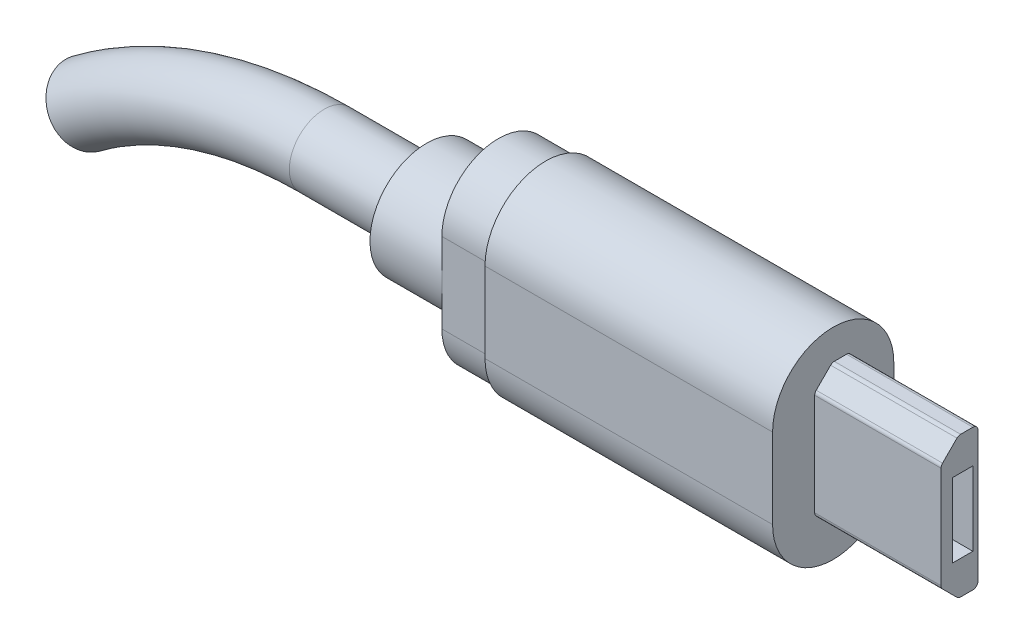
ISO-10303-21;
HEADER;
FILE_DESCRIPTION(('STEP AP214'),'2;1');
FILE_NAME('part.step','',(''),(''),'','','');
FILE_SCHEMA(('AUTOMOTIVE_DESIGN { 1 0 10303 214 1 1 1 1 }'));
ENDSEC;
DATA;
#1=APPLICATION_CONTEXT('core data for automotive mechanical design processes');
#2=APPLICATION_PROTOCOL_DEFINITION('international standard','automotive_design',2000,#1);
#3=PRODUCT_CONTEXT('',#1,'mechanical');
#4=PRODUCT('Part','Part','',(#3));
#5=PRODUCT_RELATED_PRODUCT_CATEGORY('part','',(#4));
#6=PRODUCT_DEFINITION_FORMATION('','',#4);
#7=PRODUCT_DEFINITION_CONTEXT('part definition',#1,'design');
#8=PRODUCT_DEFINITION('design','',#6,#7);
#9=PRODUCT_DEFINITION_SHAPE('','',#8);
#10=(LENGTH_UNIT() NAMED_UNIT(*) SI_UNIT(.MILLI.,.METRE.));
#11=(NAMED_UNIT(*) PLANE_ANGLE_UNIT() SI_UNIT($,.RADIAN.));
#12=(NAMED_UNIT(*) SI_UNIT($,.STERADIAN.) SOLID_ANGLE_UNIT());
#13=UNCERTAINTY_MEASURE_WITH_UNIT(LENGTH_MEASURE(1.E-05),#10,'distance_accuracy_value','');
#14=(GEOMETRIC_REPRESENTATION_CONTEXT(3) GLOBAL_UNCERTAINTY_ASSIGNED_CONTEXT((#13)) GLOBAL_UNIT_ASSIGNED_CONTEXT((#10,
#11,#12)) REPRESENTATION_CONTEXT('',''));
#15=CARTESIAN_POINT('',(0.,0.,0.));
#16=DIRECTION('',(0.,0.,1.));
#17=DIRECTION('',(1.,0.,0.));
#18=AXIS2_PLACEMENT_3D('',#15,#16,#17);
#19=CARTESIAN_POINT('',(-16.3,-1.95,0.));
#20=DIRECTION('',(1.,0.,0.));
#21=DIRECTION('',(0.,0.,-1.));
#22=AXIS2_PLACEMENT_3D('',#19,#20,#21);
#23=PLANE('',#22);
#24=CARTESIAN_POINT('',(-16.3,0.,0.));
#25=DIRECTION('',(-1.,0.,0.));
#26=DIRECTION('',(0.,0.,1.));
#27=AXIS2_PLACEMENT_3D('',#24,#25,#26);
#28=CIRCLE('',#27,2.75);
#29=CARTESIAN_POINT('',(-16.3,0.,2.75));
#30=VERTEX_POINT('',#29);
#31=CARTESIAN_POINT('',(-16.3,0.,-2.75));
#32=VERTEX_POINT('',#31);
#33=EDGE_CURVE('E291',#30,#32,#28,.T.);
#34=ORIENTED_EDGE('',*,*,#33,.F.);
#35=DIRECTION('',(0.,-1.,0.));
#36=VECTOR('',#35,1.);
#37=CARTESIAN_POINT('',(-16.3,1.95,2.75));
#38=LINE('',#37,#36);
#39=CARTESIAN_POINT('',(-16.3,1.95,2.75));
#40=VERTEX_POINT('',#39);
#41=EDGE_CURVE('E302',#40,#30,#38,.T.);
#42=ORIENTED_EDGE('',*,*,#41,.F.);
#43=CARTESIAN_POINT('',(-16.3,1.95,0.));
#44=DIRECTION('',(1.,0.,0.));
#45=DIRECTION('',(0.,0.,-1.));
#46=AXIS2_PLACEMENT_3D('',#43,#44,#45);
#47=CIRCLE('',#46,2.75);
#48=CARTESIAN_POINT('',(-16.3,1.95,-2.75));
#49=VERTEX_POINT('',#48);
#50=EDGE_CURVE('E306',#49,#40,#47,.T.);
#51=ORIENTED_EDGE('',*,*,#50,.F.);
#52=DIRECTION('',(0.,1.,0.));
#53=VECTOR('',#52,1.);
#54=CARTESIAN_POINT('',(-16.3,1.95,-2.75));
#55=LINE('',#54,#53);
#56=EDGE_CURVE('E301',#32,#49,#55,.T.);
#57=ORIENTED_EDGE('',*,*,#56,.F.);
#58=EDGE_LOOP('',(#34,#42,#51,#57));
#59=FACE_BOUND('',#58,.T.);
#60=ADVANCED_FACE('F39',(#59),#23,.F.);
#61=CARTESIAN_POINT('',(-14.,-1.95,0.));
#62=DIRECTION('',(1.,0.,0.));
#63=DIRECTION('',(0.,0.,-1.));
#64=AXIS2_PLACEMENT_3D('',#61,#62,#63);
#65=PLANE('',#64);
#66=CARTESIAN_POINT('',(-14.,-1.95,0.));
#67=DIRECTION('',(1.,0.,0.));
#68=DIRECTION('',(0.,0.,-1.));
#69=AXIS2_PLACEMENT_3D('',#66,#67,#68);
#70=CIRCLE('',#69,2.95);
#71=CARTESIAN_POINT('',(-14.,-1.95,2.95));
#72=VERTEX_POINT('',#71);
#73=CARTESIAN_POINT('',(-14.,-1.95,-2.95));
#74=VERTEX_POINT('',#73);
#75=EDGE_CURVE('E335',#72,#74,#70,.T.);
#76=ORIENTED_EDGE('',*,*,#75,.F.);
#77=DIRECTION('',(0.,-1.,0.));
#78=VECTOR('',#77,1.);
#79=CARTESIAN_POINT('',(-14.,-1.95,2.95));
#80=LINE('',#79,#78);
#81=CARTESIAN_POINT('',(-14.,1.95,2.95));
#82=VERTEX_POINT('',#81);
#83=EDGE_CURVE('E345',#82,#72,#80,.T.);
#84=ORIENTED_EDGE('',*,*,#83,.F.);
#85=CARTESIAN_POINT('',(-14.,1.95,0.));
#86=DIRECTION('',(1.,0.,0.));
#87=DIRECTION('',(0.,0.,-1.));
#88=AXIS2_PLACEMENT_3D('',#85,#86,#87);
#89=CIRCLE('',#88,2.95);
#90=CARTESIAN_POINT('',(-14.,1.95,-2.95));
#91=VERTEX_POINT('',#90);
#92=EDGE_CURVE('E342',#91,#82,#89,.T.);
#93=ORIENTED_EDGE('',*,*,#92,.F.);
#94=DIRECTION('',(0.,1.,0.));
#95=VECTOR('',#94,1.);
#96=CARTESIAN_POINT('',(-14.,-1.95,-2.95));
#97=LINE('',#96,#95);
#98=EDGE_CURVE('E338',#74,#91,#97,.T.);
#99=ORIENTED_EDGE('',*,*,#98,.F.);
#100=EDGE_LOOP('',(#76,#84,#93,#99));
#101=FACE_BOUND('',#100,.T.);
#102=CARTESIAN_POINT('',(-14.,1.95,0.));
#103=DIRECTION('',(-1.,0.,0.));
#104=DIRECTION('',(0.,0.,1.));
#105=AXIS2_PLACEMENT_3D('',#102,#103,#104);
#106=CIRCLE('',#105,2.75);
#107=CARTESIAN_POINT('',(-14.,1.95,2.75));
#108=VERTEX_POINT('',#107);
#109=CARTESIAN_POINT('',(-14.,1.95,-2.75));
#110=VERTEX_POINT('',#109);
#111=EDGE_CURVE('E295',#108,#110,#106,.T.);
#112=ORIENTED_EDGE('',*,*,#111,.F.);
#113=DIRECTION('',(0.,1.,0.));
#114=VECTOR('',#113,1.);
#115=CARTESIAN_POINT('',(-14.,1.95,2.75));
#116=LINE('',#115,#114);
#117=CARTESIAN_POINT('',(-14.,-1.95,2.75));
#118=VERTEX_POINT('',#117);
#119=EDGE_CURVE('E318',#118,#108,#116,.T.);
#120=ORIENTED_EDGE('',*,*,#119,.F.);
#121=CARTESIAN_POINT('',(-14.,-1.95,0.));
#122=DIRECTION('',(-1.,0.,0.));
#123=DIRECTION('',(0.,0.,1.));
#124=AXIS2_PLACEMENT_3D('',#121,#122,#123);
#125=CIRCLE('',#124,2.75);
#126=CARTESIAN_POINT('',(-14.,-1.95,-2.75));
#127=VERTEX_POINT('',#126);
#128=EDGE_CURVE('E315',#127,#118,#125,.T.);
#129=ORIENTED_EDGE('',*,*,#128,.F.);
#130=DIRECTION('',(0.,-1.,0.));
#131=VECTOR('',#130,1.);
#132=CARTESIAN_POINT('',(-14.,1.95,-2.75));
#133=LINE('',#132,#131);
#134=EDGE_CURVE('E312',#110,#127,#133,.T.);
#135=ORIENTED_EDGE('',*,*,#134,.F.);
#136=EDGE_LOOP('',(#112,#120,#129,#135));
#137=FACE_BOUND('',#136,.T.);
#138=ADVANCED_FACE('F478',(#101,#137),#65,.F.);
#139=CARTESIAN_POINT('',(-14.,-1.95,0.));
#140=DIRECTION('',(1.,0.,0.));
#141=DIRECTION('',(0.,0.,-1.));
#142=AXIS2_PLACEMENT_3D('',#139,#140,#141);
#143=CYLINDRICAL_SURFACE('',#142,2.95);
#144=CARTESIAN_POINT('',(0.,-1.95,0.));
#145=DIRECTION('',(1.,0.,0.));
#146=DIRECTION('',(0.,0.,-1.));
#147=AXIS2_PLACEMENT_3D('',#144,#145,#146);
#148=CIRCLE('',#147,2.95);
#149=CARTESIAN_POINT('',(0.,-1.95,2.95));
#150=VERTEX_POINT('',#149);
#151=CARTESIAN_POINT('',(0.,-1.95,-2.95));
#152=VERTEX_POINT('',#151);
#153=EDGE_CURVE('E309',#150,#152,#148,.T.);
#154=ORIENTED_EDGE('',*,*,#153,.F.);
#155=DIRECTION('',(1.,0.,0.));
#156=VECTOR('',#155,1.);
#157=CARTESIAN_POINT('',(-14.,-1.95,2.95));
#158=LINE('',#157,#156);
#159=EDGE_CURVE('E359',#72,#150,#158,.T.);
#160=ORIENTED_EDGE('',*,*,#159,.F.);
#161=ORIENTED_EDGE('',*,*,#75,.T.);
#162=DIRECTION('',(1.,0.,0.));
#163=VECTOR('',#162,1.);
#164=CARTESIAN_POINT('',(-14.,-1.95,-2.95));
#165=LINE('',#164,#163);
#166=EDGE_CURVE('E348',#74,#152,#165,.T.);
#167=ORIENTED_EDGE('',*,*,#166,.T.);
#168=EDGE_LOOP('',(#154,#160,#161,#167));
#169=FACE_BOUND('',#168,.T.);
#170=ADVANCED_FACE('F485',(#169),#143,.T.);
#171=CARTESIAN_POINT('',(-14.,-1.95,2.95));
#172=DIRECTION('',(0.,0.,1.));
#173=DIRECTION('',(0.,-1.,0.));
#174=AXIS2_PLACEMENT_3D('',#171,#172,#173);
#175=PLANE('',#174);
#176=DIRECTION('',(0.,-1.,0.));
#177=VECTOR('',#176,1.);
#178=CARTESIAN_POINT('',(0.,-1.95,2.95));
#179=LINE('',#178,#177);
#180=CARTESIAN_POINT('',(0.,1.95,2.95));
#181=VERTEX_POINT('',#180);
#182=EDGE_CURVE('E339',#181,#150,#179,.T.);
#183=ORIENTED_EDGE('',*,*,#182,.F.);
#184=DIRECTION('',(1.,0.,0.));
#185=VECTOR('',#184,1.);
#186=CARTESIAN_POINT('',(-14.,1.95,2.95));
#187=LINE('',#186,#185);
#188=EDGE_CURVE('E361',#82,#181,#187,.T.);
#189=ORIENTED_EDGE('',*,*,#188,.F.);
#190=ORIENTED_EDGE('',*,*,#83,.T.);
#191=ORIENTED_EDGE('',*,*,#159,.T.);
#192=EDGE_LOOP('',(#183,#189,#190,#191));
#193=FACE_BOUND('',#192,.T.);
#194=ADVANCED_FACE('F532',(#193),#175,.T.);
#195=CARTESIAN_POINT('',(-14.,1.95,0.));
#196=DIRECTION('',(1.,0.,0.));
#197=DIRECTION('',(0.,0.,-1.));
#198=AXIS2_PLACEMENT_3D('',#195,#196,#197);
#199=CYLINDRICAL_SURFACE('',#198,2.95);
#200=CARTESIAN_POINT('',(0.,1.95,0.));
#201=DIRECTION('',(1.,0.,0.));
#202=DIRECTION('',(0.,0.,-1.));
#203=AXIS2_PLACEMENT_3D('',#200,#201,#202);
#204=CIRCLE('',#203,2.95);
#205=CARTESIAN_POINT('',(0.,1.95,-2.95));
#206=VERTEX_POINT('',#205);
#207=EDGE_CURVE('E354',#206,#181,#204,.T.);
#208=ORIENTED_EDGE('',*,*,#207,.F.);
#209=DIRECTION('',(1.,0.,0.));
#210=VECTOR('',#209,1.);
#211=CARTESIAN_POINT('',(-14.,1.95,-2.95));
#212=LINE('',#211,#210);
#213=EDGE_CURVE('E363',#91,#206,#212,.T.);
#214=ORIENTED_EDGE('',*,*,#213,.F.);
#215=ORIENTED_EDGE('',*,*,#92,.T.);
#216=ORIENTED_EDGE('',*,*,#188,.T.);
#217=EDGE_LOOP('',(#208,#214,#215,#216));
#218=FACE_BOUND('',#217,.T.);
#219=ADVANCED_FACE('F535',(#218),#199,.T.);
#220=CARTESIAN_POINT('',(-14.,-1.95,-2.95));
#221=DIRECTION('',(0.,0.,-1.));
#222=DIRECTION('',(0.,1.,0.));
#223=AXIS2_PLACEMENT_3D('',#220,#221,#222);
#224=PLANE('',#223);
#225=DIRECTION('',(0.,1.,0.));
#226=VECTOR('',#225,1.);
#227=CARTESIAN_POINT('',(0.,-1.95,-2.95));
#228=LINE('',#227,#226);
#229=EDGE_CURVE('E351',#152,#206,#228,.T.);
#230=ORIENTED_EDGE('',*,*,#229,.F.);
#231=ORIENTED_EDGE('',*,*,#166,.F.);
#232=ORIENTED_EDGE('',*,*,#98,.T.);
#233=ORIENTED_EDGE('',*,*,#213,.T.);
#234=EDGE_LOOP('',(#230,#231,#232,#233));
#235=FACE_BOUND('',#234,.T.);
#236=ADVANCED_FACE('F527',(#235),#224,.T.);
#237=CARTESIAN_POINT('',(0.,-1.95,0.));
#238=DIRECTION('',(1.,0.,0.));
#239=DIRECTION('',(0.,0.,-1.));
#240=AXIS2_PLACEMENT_3D('',#237,#238,#239);
#241=PLANE('',#240);
#242=DIRECTION('',(0.,0.,1.));
#243=VECTOR('',#242,1.);
#244=CARTESIAN_POINT('',(0.,3.43,0.0499999999999822));
#245=LINE('',#244,#243);
#246=CARTESIAN_POINT('',(0.,3.43,-0.650000000000016));
#247=VERTEX_POINT('',#246);
#248=CARTESIAN_POINT('',(0.,3.43,-0.0535533905932885));
#249=VERTEX_POINT('',#248);
#250=EDGE_CURVE('E243',#247,#249,#245,.T.);
#251=ORIENTED_EDGE('',*,*,#250,.F.);
#252=CARTESIAN_POINT('',(0.,3.18,-0.650000000000016));
#253=DIRECTION('',(1.,0.,0.));
#254=DIRECTION('',(0.,0.,-1.));
#255=AXIS2_PLACEMENT_3D('',#252,#253,#254);
#256=CIRCLE('',#255,0.25);
#257=CARTESIAN_POINT('',(0.,3.17999999999999,-0.900000000000016));
#258=VERTEX_POINT('',#257);
#259=EDGE_CURVE('E409',#247,#258,#256,.F.);
#260=ORIENTED_EDGE('',*,*,#259,.T.);
#261=DIRECTION('',(0.,1.,0.));
#262=VECTOR('',#261,1.);
#263=CARTESIAN_POINT('',(0.,-3.43000000000001,-0.89999999999998));
#264=LINE('',#263,#262);
#265=CARTESIAN_POINT('',(0.,-3.18000000000001,-0.899999999999981));
#266=VERTEX_POINT('',#265);
#267=EDGE_CURVE('E251',#266,#258,#264,.T.);
#268=ORIENTED_EDGE('',*,*,#267,.F.);
#269=CARTESIAN_POINT('',(0.,-3.18000000000001,-0.649999999999981));
#270=DIRECTION('',(1.,0.,0.));
#271=DIRECTION('',(0.,0.,-1.));
#272=AXIS2_PLACEMENT_3D('',#269,#270,#271);
#273=CIRCLE('',#272,0.25);
#274=CARTESIAN_POINT('',(0.,-3.43000000000001,-0.649999999999979));
#275=VERTEX_POINT('',#274);
#276=EDGE_CURVE('E407',#266,#275,#273,.F.);
#277=ORIENTED_EDGE('',*,*,#276,.T.);
#278=DIRECTION('',(0.,0.,-1.));
#279=VECTOR('',#278,1.);
#280=CARTESIAN_POINT('',(0.,-3.43,0.0499999999999762));
#281=LINE('',#280,#279);
#282=CARTESIAN_POINT('',(0.,-3.43,-0.053553390593295));
#283=VERTEX_POINT('',#282);
#284=EDGE_CURVE('E277',#283,#275,#281,.T.);
#285=ORIENTED_EDGE('',*,*,#284,.F.);
#286=CARTESIAN_POINT('',(0.,-3.18,-0.0535533905932969));
#287=DIRECTION('',(1.,0.,0.));
#288=DIRECTION('',(0.,0.,-1.));
#289=AXIS2_PLACEMENT_3D('',#286,#287,#288);
#290=CIRCLE('',#289,0.25);
#291=CARTESIAN_POINT('',(0.,-3.35677669529664,0.123223304703339));
#292=VERTEX_POINT('',#291);
#293=EDGE_CURVE('E47',#283,#292,#290,.F.);
#294=ORIENTED_EDGE('',*,*,#293,.T.);
#295=DIRECTION('',(0.,-0.707106781186542,-0.707106781186553));
#296=VECTOR('',#295,1.);
#297=CARTESIAN_POINT('',(0.,-3.43,0.0499999999999762));
#298=LINE('',#297,#296);
#299=CARTESIAN_POINT('',(0.,-2.65322330470337,0.826776695296619));
#300=VERTEX_POINT('',#299);
#301=EDGE_CURVE('E275',#300,#292,#298,.T.);
#302=ORIENTED_EDGE('',*,*,#301,.F.);
#303=CARTESIAN_POINT('',(0.,-2.47644660940673,0.649999999999983));
#304=DIRECTION('',(1.,0.,0.));
#305=DIRECTION('',(0.,0.,-1.));
#306=AXIS2_PLACEMENT_3D('',#303,#304,#305);
#307=CIRCLE('',#306,0.25);
#308=CARTESIAN_POINT('',(0.,-2.47644660940673,0.899999999999983));
#309=VERTEX_POINT('',#308);
#310=EDGE_CURVE('E12',#300,#309,#307,.F.);
#311=ORIENTED_EDGE('',*,*,#310,.T.);
#312=DIRECTION('',(0.,-1.,0.));
#313=VECTOR('',#312,1.);
#314=CARTESIAN_POINT('',(0.,-2.58000000000001,0.899999999999982));
#315=LINE('',#314,#313);
#316=CARTESIAN_POINT('',(0.,2.47644660940672,0.900000000000018));
#317=VERTEX_POINT('',#316);
#318=EDGE_CURVE('E272',#317,#309,#315,.T.);
#319=ORIENTED_EDGE('',*,*,#318,.F.);
#320=CARTESIAN_POINT('',(0.,2.47644660940672,0.650000000000018));
#321=DIRECTION('',(1.,0.,0.));
#322=DIRECTION('',(0.,0.,-1.));
#323=AXIS2_PLACEMENT_3D('',#320,#321,#322);
#324=CIRCLE('',#323,0.25);
#325=CARTESIAN_POINT('',(0.,2.65322330470336,0.826776695296651));
#326=VERTEX_POINT('',#325);
#327=EDGE_CURVE('E413',#317,#326,#324,.F.);
#328=ORIENTED_EDGE('',*,*,#327,.T.);
#329=DIRECTION('',(0.,-0.707106781186533,0.707106781186562));
#330=VECTOR('',#329,1.);
#331=CARTESIAN_POINT('',(0.,2.57999999999999,0.900000000000019));
#332=LINE('',#331,#330);
#333=CARTESIAN_POINT('',(0.,3.35677669529664,0.123223304703345));
#334=VERTEX_POINT('',#333);
#335=EDGE_CURVE('E269',#334,#326,#332,.T.);
#336=ORIENTED_EDGE('',*,*,#335,.F.);
#337=CARTESIAN_POINT('',(0.,3.18,-0.0535533905932886));
#338=DIRECTION('',(1.,0.,0.));
#339=DIRECTION('',(0.,0.,-1.));
#340=AXIS2_PLACEMENT_3D('',#337,#338,#339);
#341=CIRCLE('',#340,0.25);
#342=EDGE_CURVE('E411',#334,#249,#341,.F.);
#343=ORIENTED_EDGE('',*,*,#342,.T.);
#344=EDGE_LOOP('',(#251,#260,#268,#277,#285,#294,#302,#311,#319,#328,#336,#343));
#345=FACE_BOUND('',#344,.T.);
#346=ORIENTED_EDGE('',*,*,#153,.T.);
#347=ORIENTED_EDGE('',*,*,#229,.T.);
#348=ORIENTED_EDGE('',*,*,#207,.T.);
#349=ORIENTED_EDGE('',*,*,#182,.T.);
#350=EDGE_LOOP('',(#346,#347,#348,#349));
#351=FACE_BOUND('',#350,.T.);
#352=ADVANCED_FACE('F417',(#345,#351),#241,.T.);
#353=CARTESIAN_POINT('',(-43.4908218239029,1.95,2.75));
#354=DIRECTION('',(0.,0.,-1.));
#355=DIRECTION('',(0.,1.,0.));
#356=AXIS2_PLACEMENT_3D('',#353,#354,#355);
#357=PLANE('',#356);
#358=DIRECTION('',(1.,0.,0.));
#359=VECTOR('',#358,1.);
#360=CARTESIAN_POINT('',(-43.4908218239029,1.95,2.75));
#361=LINE('',#360,#359);
#362=EDGE_CURVE('E321',#40,#108,#361,.T.);
#363=ORIENTED_EDGE('',*,*,#362,.F.);
#364=ORIENTED_EDGE('',*,*,#41,.T.);
#365=CARTESIAN_POINT('',(-16.3,-1.95,2.75));
#366=VERTEX_POINT('',#365);
#367=EDGE_CURVE('E333',#30,#366,#38,.T.);
#368=ORIENTED_EDGE('',*,*,#367,.T.);
#369=DIRECTION('',(1.,0.,0.));
#370=VECTOR('',#369,1.);
#371=CARTESIAN_POINT('',(-43.4908218239029,-1.95,2.75));
#372=LINE('',#371,#370);
#373=EDGE_CURVE('E324',#366,#118,#372,.T.);
#374=ORIENTED_EDGE('',*,*,#373,.T.);
#375=ORIENTED_EDGE('',*,*,#119,.T.);
#376=EDGE_LOOP('',(#363,#364,#368,#374,#375));
#377=FACE_BOUND('',#376,.T.);
#378=ADVANCED_FACE('F518',(#377),#357,.F.);
#379=CARTESIAN_POINT('',(-43.4908218239029,-1.95,0.));
#380=DIRECTION('',(1.,0.,0.));
#381=DIRECTION('',(0.,0.,-1.));
#382=AXIS2_PLACEMENT_3D('',#379,#380,#381);
#383=CYLINDRICAL_SURFACE('',#382,2.75);
#384=ORIENTED_EDGE('',*,*,#373,.F.);
#385=CARTESIAN_POINT('',(-16.3,-1.95,0.));
#386=DIRECTION('',(1.,0.,0.));
#387=DIRECTION('',(0.,0.,-1.));
#388=AXIS2_PLACEMENT_3D('',#385,#386,#387);
#389=CIRCLE('',#388,2.75);
#390=CARTESIAN_POINT('',(-16.3,-1.95,-2.75));
#391=VERTEX_POINT('',#390);
#392=EDGE_CURVE('E298',#366,#391,#389,.T.);
#393=ORIENTED_EDGE('',*,*,#392,.T.);
#394=DIRECTION('',(1.,0.,0.));
#395=VECTOR('',#394,1.);
#396=CARTESIAN_POINT('',(-43.4908218239029,-1.95,-2.75));
#397=LINE('',#396,#395);
#398=EDGE_CURVE('E327',#391,#127,#397,.T.);
#399=ORIENTED_EDGE('',*,*,#398,.T.);
#400=ORIENTED_EDGE('',*,*,#128,.T.);
#401=EDGE_LOOP('',(#384,#393,#399,#400));
#402=FACE_BOUND('',#401,.T.);
#403=ADVANCED_FACE('F515',(#402),#383,.T.);
#404=CARTESIAN_POINT('',(-43.4908218239029,1.95,-2.75));
#405=DIRECTION('',(0.,0.,1.));
#406=DIRECTION('',(0.,-1.,0.));
#407=AXIS2_PLACEMENT_3D('',#404,#405,#406);
#408=PLANE('',#407);
#409=ORIENTED_EDGE('',*,*,#398,.F.);
#410=EDGE_CURVE('E303',#391,#32,#55,.T.);
#411=ORIENTED_EDGE('',*,*,#410,.T.);
#412=ORIENTED_EDGE('',*,*,#56,.T.);
#413=DIRECTION('',(1.,0.,0.));
#414=VECTOR('',#413,1.);
#415=CARTESIAN_POINT('',(-43.4908218239029,1.95,-2.75));
#416=LINE('',#415,#414);
#417=EDGE_CURVE('E330',#49,#110,#416,.T.);
#418=ORIENTED_EDGE('',*,*,#417,.T.);
#419=ORIENTED_EDGE('',*,*,#134,.T.);
#420=EDGE_LOOP('',(#409,#411,#412,#418,#419));
#421=FACE_BOUND('',#420,.T.);
#422=ADVANCED_FACE('F501',(#421),#408,.F.);
#423=CARTESIAN_POINT('',(-43.4908218239029,1.95,0.));
#424=DIRECTION('',(1.,0.,0.));
#425=DIRECTION('',(0.,0.,-1.));
#426=AXIS2_PLACEMENT_3D('',#423,#424,#425);
#427=CYLINDRICAL_SURFACE('',#426,2.75);
#428=ORIENTED_EDGE('',*,*,#417,.F.);
#429=ORIENTED_EDGE('',*,*,#50,.T.);
#430=ORIENTED_EDGE('',*,*,#362,.T.);
#431=ORIENTED_EDGE('',*,*,#111,.T.);
#432=EDGE_LOOP('',(#428,#429,#430,#431));
#433=FACE_BOUND('',#432,.T.);
#434=ADVANCED_FACE('F493',(#433),#427,.T.);
#435=EDGE_CURVE('E286',#32,#30,#28,.T.);
#436=ORIENTED_EDGE('',*,*,#435,.F.);
#437=ORIENTED_EDGE('',*,*,#410,.F.);
#438=ORIENTED_EDGE('',*,*,#392,.F.);
#439=ORIENTED_EDGE('',*,*,#367,.F.);
#440=EDGE_LOOP('',(#436,#437,#438,#439));
#441=FACE_BOUND('',#440,.T.);
#442=ADVANCED_FACE('F481',(#441),#23,.F.);
#443=CARTESIAN_POINT('',(-19.8,0.,0.));
#444=DIRECTION('',(1.,0.,0.));
#445=DIRECTION('',(0.,0.,-1.));
#446=AXIS2_PLACEMENT_3D('',#443,#444,#445);
#447=CYLINDRICAL_SURFACE('',#446,2.75);
#448=CARTESIAN_POINT('',(-19.8,0.,0.));
#449=DIRECTION('',(-1.,0.,0.));
#450=DIRECTION('',(0.,0.,1.));
#451=AXIS2_PLACEMENT_3D('',#448,#449,#450);
#452=CIRCLE('',#451,2.75);
#453=CARTESIAN_POINT('',(-19.8,0.,2.75));
#454=VERTEX_POINT('',#453);
#455=EDGE_CURVE('E292',#454,#454,#452,.T.);
#456=ORIENTED_EDGE('',*,*,#455,.F.);
#457=EDGE_LOOP('',(#456));
#458=FACE_BOUND('',#457,.T.);
#459=ORIENTED_EDGE('',*,*,#33,.T.);
#460=ORIENTED_EDGE('',*,*,#435,.T.);
#461=EDGE_LOOP('',(#459,#460));
#462=FACE_BOUND('',#461,.T.);
#463=ADVANCED_FACE('F492',(#458,#462),#447,.T.);
#464=CARTESIAN_POINT('',(-19.8,0.,0.));
#465=DIRECTION('',(-1.,0.,0.));
#466=DIRECTION('',(0.,0.,1.));
#467=AXIS2_PLACEMENT_3D('',#464,#465,#466);
#468=PLANE('',#467);
#469=CARTESIAN_POINT('',(-19.8,0.,0.));
#470=DIRECTION('',(-1.,0.,0.));
#471=DIRECTION('',(0.,0.,1.));
#472=AXIS2_PLACEMENT_3D('',#469,#470,#471);
#473=CIRCLE('',#472,1.7);
#474=CARTESIAN_POINT('',(-19.8,0.,1.7));
#475=VERTEX_POINT('',#474);
#476=EDGE_CURVE('E282',#475,#475,#473,.T.);
#477=ORIENTED_EDGE('',*,*,#476,.F.);
#478=EDGE_LOOP('',(#477));
#479=FACE_BOUND('',#478,.T.);
#480=ORIENTED_EDGE('',*,*,#455,.T.);
#481=EDGE_LOOP('',(#480));
#482=FACE_BOUND('',#481,.T.);
#483=ADVANCED_FACE('F499',(#479,#482),#468,.T.);
#484=CARTESIAN_POINT('',(-36.3421818285019,-3.84559105512494,0.));
#485=DIRECTION('',(-0.800909636192724,-0.598785232494622,0.));
#486=DIRECTION('',(0.,0.,1.));
#487=AXIS2_PLACEMENT_3D('',#484,#485,#486);
#488=PLANE('',#487);
#489=CARTESIAN_POINT('',(-36.3421818285019,-3.84559105512494,0.));
#490=DIRECTION('',(-0.800909636192724,-0.598785232494622,0.));
#491=DIRECTION('',(0.,0.,1.));
#492=AXIS2_PLACEMENT_3D('',#489,#490,#491);
#493=CIRCLE('',#492,1.7);
#494=CARTESIAN_POINT('',(-36.3421818285019,-3.84559105512494,1.7));
#495=VERTEX_POINT('',#494);
#496=EDGE_CURVE('E289',#495,#495,#493,.T.);
#497=ORIENTED_EDGE('',*,*,#496,.T.);
#498=EDGE_LOOP('',(#497));
#499=FACE_BOUND('',#498,.T.);
#500=ADVANCED_FACE('F570',(#499),#488,.T.);
#501=CARTESIAN_POINT('',(-19.8,0.,0.));
#502=DIRECTION('',(-1.,0.,0.));
#503=DIRECTION('',(0.,0.,1.));
#504=AXIS2_PLACEMENT_3D('',#501,#502,#503);
#505=CYLINDRICAL_SURFACE('',#504,1.7);
#506=CARTESIAN_POINT('',(-24.7761618063009,0.,0.));
#507=DIRECTION('',(-1.,0.,0.));
#508=DIRECTION('',(0.,0.,1.));
#509=AXIS2_PLACEMENT_3D('',#506,#507,#508);
#510=CIRCLE('',#509,1.7);
#511=CARTESIAN_POINT('',(-24.7761618063009,0.,1.7));
#512=VERTEX_POINT('',#511);
#513=EDGE_CURVE('E266',#512,#512,#510,.T.);
#514=ORIENTED_EDGE('',*,*,#513,.F.);
#515=EDGE_LOOP('',(#514));
#516=FACE_BOUND('',#515,.T.);
#517=ORIENTED_EDGE('',*,*,#476,.T.);
#518=EDGE_LOOP('',(#517));
#519=FACE_BOUND('',#518,.T.);
#520=ADVANCED_FACE('F571',(#516,#519),#505,.T.);
#521=CARTESIAN_POINT('',(-24.7761618063009,-19.3158070615993,0.));
#522=DIRECTION('',(0.,0.,1.));
#523=DIRECTION('',(1.,0.,0.));
#524=AXIS2_PLACEMENT_3D('',#521,#522,#523);
#525=TOROIDAL_SURFACE('',#524,19.3158070615993,1.7);
#526=ORIENTED_EDGE('',*,*,#496,.F.);
#527=EDGE_LOOP('',(#526));
#528=FACE_BOUND('',#527,.T.);
#529=ORIENTED_EDGE('',*,*,#513,.T.);
#530=EDGE_LOOP('',(#529));
#531=FACE_BOUND('',#530,.T.);
#532=ADVANCED_FACE('F569',(#528,#531),#525,.T.);
#533=CARTESIAN_POINT('',(6.15,3.43,0.0499999999999822));
#534=DIRECTION('',(0.,-1.,0.));
#535=DIRECTION('',(0.,0.,-1.));
#536=AXIS2_PLACEMENT_3D('',#533,#534,#535);
#537=PLANE('',#536);
#538=DIRECTION('',(0.,0.,1.));
#539=VECTOR('',#538,1.);
#540=CARTESIAN_POINT('',(6.15,3.43,0.0499999999999822));
#541=LINE('',#540,#539);
#542=CARTESIAN_POINT('',(6.15,3.43,-0.650000000000016));
#543=VERTEX_POINT('',#542);
#544=CARTESIAN_POINT('',(6.15,3.43,-0.0535533905932885));
#545=VERTEX_POINT('',#544);
#546=EDGE_CURVE('E247',#543,#545,#541,.T.);
#547=ORIENTED_EDGE('',*,*,#546,.F.);
#548=DIRECTION('',(-1.,0.,0.));
#549=VECTOR('',#548,1.);
#550=CARTESIAN_POINT('',(6.15,3.43,-0.650000000000016));
#551=LINE('',#550,#549);
#552=EDGE_CURVE('E389',#543,#247,#551,.T.);
#553=ORIENTED_EDGE('',*,*,#552,.T.);
#554=ORIENTED_EDGE('',*,*,#250,.T.);
#555=DIRECTION('',(-1.,0.,0.));
#556=VECTOR('',#555,1.);
#557=CARTESIAN_POINT('',(6.15,3.43,-0.0535533905932885));
#558=LINE('',#557,#556);
#559=EDGE_CURVE('E387',#249,#545,#558,.F.);
#560=ORIENTED_EDGE('',*,*,#559,.T.);
#561=EDGE_LOOP('',(#547,#553,#554,#560));
#562=FACE_BOUND('',#561,.T.);
#563=ADVANCED_FACE('F465',(#562),#537,.F.);
#564=CARTESIAN_POINT('',(6.15,2.57999999999999,0.900000000000019));
#565=DIRECTION('',(0.,-0.707106781186562,-0.707106781186533));
#566=DIRECTION('',(0.,0.707106781186533,-0.707106781186562));
#567=AXIS2_PLACEMENT_3D('',#564,#565,#566);
#568=PLANE('',#567);
#569=DIRECTION('',(0.,-0.707106781186533,0.707106781186562));
#570=VECTOR('',#569,1.);
#571=CARTESIAN_POINT('',(6.15,2.57999999999999,0.900000000000019));
#572=LINE('',#571,#570);
#573=CARTESIAN_POINT('',(6.15,3.35677669529664,0.123223304703345));
#574=VERTEX_POINT('',#573);
#575=CARTESIAN_POINT('',(6.15,2.65322330470336,0.826776695296651));
#576=VERTEX_POINT('',#575);
#577=EDGE_CURVE('E250',#574,#576,#572,.T.);
#578=ORIENTED_EDGE('',*,*,#577,.F.);
#579=DIRECTION('',(-1.,0.,0.));
#580=VECTOR('',#579,1.);
#581=CARTESIAN_POINT('',(6.15,3.35677669529664,0.123223304703345));
#582=LINE('',#581,#580);
#583=EDGE_CURVE('E394',#574,#334,#582,.T.);
#584=ORIENTED_EDGE('',*,*,#583,.T.);
#585=ORIENTED_EDGE('',*,*,#335,.T.);
#586=DIRECTION('',(-1.,0.,0.));
#587=VECTOR('',#586,1.);
#588=CARTESIAN_POINT('',(6.15,2.65322330470336,0.826776695296651));
#589=LINE('',#588,#587);
#590=EDGE_CURVE('E392',#326,#576,#589,.F.);
#591=ORIENTED_EDGE('',*,*,#590,.T.);
#592=EDGE_LOOP('',(#578,#584,#585,#591));
#593=FACE_BOUND('',#592,.T.);
#594=ADVANCED_FACE('F424',(#593),#568,.F.);
#595=CARTESIAN_POINT('',(6.15,-2.58000000000001,0.899999999999982));
#596=DIRECTION('',(0.,0.,-1.));
#597=DIRECTION('',(0.,1.,0.));
#598=AXIS2_PLACEMENT_3D('',#595,#596,#597);
#599=PLANE('',#598);
#600=DIRECTION('',(0.,-1.,0.));
#601=VECTOR('',#600,1.);
#602=CARTESIAN_POINT('',(6.15,-2.58000000000001,0.899999999999982));
#603=LINE('',#602,#601);
#604=CARTESIAN_POINT('',(6.15,2.47644660940672,0.900000000000018));
#605=VERTEX_POINT('',#604);
#606=CARTESIAN_POINT('',(6.15,-2.47644660940673,0.899999999999983));
#607=VERTEX_POINT('',#606);
#608=EDGE_CURVE('E254',#605,#607,#603,.T.);
#609=ORIENTED_EDGE('',*,*,#608,.F.);
#610=DIRECTION('',(-1.,0.,0.));
#611=VECTOR('',#610,1.);
#612=CARTESIAN_POINT('',(6.15,2.47644660940672,0.900000000000018));
#613=LINE('',#612,#611);
#614=EDGE_CURVE('E399',#605,#317,#613,.T.);
#615=ORIENTED_EDGE('',*,*,#614,.T.);
#616=ORIENTED_EDGE('',*,*,#318,.T.);
#617=DIRECTION('',(-1.,0.,0.));
#618=VECTOR('',#617,1.);
#619=CARTESIAN_POINT('',(6.15,-2.47644660940673,0.899999999999983));
#620=LINE('',#619,#618);
#621=EDGE_CURVE('E397',#309,#607,#620,.F.);
#622=ORIENTED_EDGE('',*,*,#621,.T.);
#623=EDGE_LOOP('',(#609,#615,#616,#622));
#624=FACE_BOUND('',#623,.T.);
#625=ADVANCED_FACE('F433',(#624),#599,.F.);
#626=CARTESIAN_POINT('',(6.15,-3.43,0.0499999999999762));
#627=DIRECTION('',(0.,0.707106781186553,-0.707106781186542));
#628=DIRECTION('',(0.,0.707106781186542,0.707106781186553));
#629=AXIS2_PLACEMENT_3D('',#626,#627,#628);
#630=PLANE('',#629);
#631=ORIENTED_EDGE('',*,*,#301,.T.);
#632=DIRECTION('',(-1.,0.,0.));
#633=VECTOR('',#632,1.);
#634=CARTESIAN_POINT('',(6.15,-3.35677669529664,0.123223304703339));
#635=LINE('',#634,#633);
#636=CARTESIAN_POINT('',(6.15,-3.35677669529664,0.123223304703339));
#637=VERTEX_POINT('',#636);
#638=EDGE_CURVE('E405',#292,#637,#635,.F.);
#639=ORIENTED_EDGE('',*,*,#638,.T.);
#640=DIRECTION('',(0.,-0.707106781186542,-0.707106781186553));
#641=VECTOR('',#640,1.);
#642=CARTESIAN_POINT('',(6.15,-3.43,0.0499999999999762));
#643=LINE('',#642,#641);
#644=CARTESIAN_POINT('',(6.15,-2.65322330470337,0.826776695296619));
#645=VERTEX_POINT('',#644);
#646=EDGE_CURVE('E257',#645,#637,#643,.T.);
#647=ORIENTED_EDGE('',*,*,#646,.F.);
#648=DIRECTION('',(-1.,0.,0.));
#649=VECTOR('',#648,1.);
#650=CARTESIAN_POINT('',(6.15,-2.65322330470337,0.826776695296619));
#651=LINE('',#650,#649);
#652=EDGE_CURVE('E402',#645,#300,#651,.T.);
#653=ORIENTED_EDGE('',*,*,#652,.T.);
#654=EDGE_LOOP('',(#631,#639,#647,#653));
#655=FACE_BOUND('',#654,.T.);
#656=ADVANCED_FACE('F440',(#655),#630,.F.);
#657=CARTESIAN_POINT('',(6.15,-3.43,0.0499999999999762));
#658=DIRECTION('',(0.,1.,0.));
#659=DIRECTION('',(0.,0.,1.));
#660=AXIS2_PLACEMENT_3D('',#657,#658,#659);
#661=PLANE('',#660);
#662=ORIENTED_EDGE('',*,*,#284,.T.);
#663=DIRECTION('',(-1.,0.,0.));
#664=VECTOR('',#663,1.);
#665=CARTESIAN_POINT('',(6.15,-3.43000000000001,-0.649999999999979));
#666=LINE('',#665,#664);
#667=CARTESIAN_POINT('',(6.15,-3.43000000000001,-0.649999999999979));
#668=VERTEX_POINT('',#667);
#669=EDGE_CURVE('E373',#275,#668,#666,.F.);
#670=ORIENTED_EDGE('',*,*,#669,.T.);
#671=DIRECTION('',(0.,0.,-1.));
#672=VECTOR('',#671,1.);
#673=CARTESIAN_POINT('',(6.15,-3.43,0.0499999999999762));
#674=LINE('',#673,#672);
#675=CARTESIAN_POINT('',(6.15,-3.43,-0.053553390593295));
#676=VERTEX_POINT('',#675);
#677=EDGE_CURVE('E260',#676,#668,#674,.T.);
#678=ORIENTED_EDGE('',*,*,#677,.F.);
#679=DIRECTION('',(-1.,0.,0.));
#680=VECTOR('',#679,1.);
#681=CARTESIAN_POINT('',(6.15,-3.43,-0.053553390593295));
#682=LINE('',#681,#680);
#683=EDGE_CURVE('E370',#676,#283,#682,.T.);
#684=ORIENTED_EDGE('',*,*,#683,.T.);
#685=EDGE_LOOP('',(#662,#670,#678,#684));
#686=FACE_BOUND('',#685,.T.);
#687=ADVANCED_FACE('F448',(#686),#661,.F.);
#688=CARTESIAN_POINT('',(6.15,-3.43000000000001,-0.89999999999998));
#689=DIRECTION('',(0.,0.,1.));
#690=DIRECTION('',(0.,-1.,0.));
#691=AXIS2_PLACEMENT_3D('',#688,#689,#690);
#692=PLANE('',#691);
#693=DIRECTION('',(0.,1.,0.));
#694=VECTOR('',#693,1.);
#695=CARTESIAN_POINT('',(6.15,-3.43000000000001,-0.89999999999998));
#696=LINE('',#695,#694);
#697=CARTESIAN_POINT('',(6.15,-3.18000000000001,-0.899999999999981));
#698=VERTEX_POINT('',#697);
#699=CARTESIAN_POINT('',(6.15,3.17999999999999,-0.900000000000016));
#700=VERTEX_POINT('',#699);
#701=EDGE_CURVE('E263',#698,#700,#696,.T.);
#702=ORIENTED_EDGE('',*,*,#701,.F.);
#703=DIRECTION('',(-1.,0.,0.));
#704=VECTOR('',#703,1.);
#705=CARTESIAN_POINT('',(6.15,-3.18000000000001,-0.899999999999981));
#706=LINE('',#705,#704);
#707=EDGE_CURVE('E367',#698,#266,#706,.T.);
#708=ORIENTED_EDGE('',*,*,#707,.T.);
#709=ORIENTED_EDGE('',*,*,#267,.T.);
#710=DIRECTION('',(-1.,0.,0.));
#711=VECTOR('',#710,1.);
#712=CARTESIAN_POINT('',(6.15,3.17999999999999,-0.900000000000016));
#713=LINE('',#712,#711);
#714=EDGE_CURVE('E285',#258,#700,#713,.F.);
#715=ORIENTED_EDGE('',*,*,#714,.T.);
#716=EDGE_LOOP('',(#702,#708,#709,#715));
#717=FACE_BOUND('',#716,.T.);
#718=ADVANCED_FACE('F456',(#717),#692,.F.);
#719=CARTESIAN_POINT('',(6.15,0.,0.));
#720=DIRECTION('',(1.,0.,0.));
#721=DIRECTION('',(0.,0.,-1.));
#722=AXIS2_PLACEMENT_3D('',#719,#720,#721);
#723=PLANE('',#722);
#724=DIRECTION('',(0.,1.,0.));
#725=VECTOR('',#724,1.);
#726=CARTESIAN_POINT('',(6.15,-1.8,-0.649999999999981));
#727=LINE('',#726,#725);
#728=CARTESIAN_POINT('',(6.15,-1.8,-0.649999999999981));
#729=VERTEX_POINT('',#728);
#730=CARTESIAN_POINT('',(6.15,1.8,-0.649999999999981));
#731=VERTEX_POINT('',#730);
#732=EDGE_CURVE('E54',#729,#731,#727,.T.);
#733=ORIENTED_EDGE('',*,*,#732,.F.);
#734=DIRECTION('',(0.,0.,-1.));
#735=VECTOR('',#734,1.);
#736=CARTESIAN_POINT('',(6.15,-1.8,-0.649999999999981));
#737=LINE('',#736,#735);
#738=CARTESIAN_POINT('',(6.15,-1.8,0.350000000000019));
#739=VERTEX_POINT('',#738);
#740=EDGE_CURVE('E228',#739,#729,#737,.T.);
#741=ORIENTED_EDGE('',*,*,#740,.F.);
#742=DIRECTION('',(0.,-1.,0.));
#743=VECTOR('',#742,1.);
#744=CARTESIAN_POINT('',(6.15,-1.8,0.350000000000019));
#745=LINE('',#744,#743);
#746=CARTESIAN_POINT('',(6.15,1.8,0.350000000000019));
#747=VERTEX_POINT('',#746);
#748=EDGE_CURVE('E231',#747,#739,#745,.T.);
#749=ORIENTED_EDGE('',*,*,#748,.F.);
#750=DIRECTION('',(0.,0.,1.));
#751=VECTOR('',#750,1.);
#752=CARTESIAN_POINT('',(6.15,1.8,-0.649999999999981));
#753=LINE('',#752,#751);
#754=EDGE_CURVE('E237',#731,#747,#753,.T.);
#755=ORIENTED_EDGE('',*,*,#754,.F.);
#756=EDGE_LOOP('',(#733,#741,#749,#755));
#757=FACE_BOUND('',#756,.T.);
#758=ORIENTED_EDGE('',*,*,#677,.T.);
#759=CARTESIAN_POINT('',(6.15,-3.18000000000001,-0.649999999999981));
#760=DIRECTION('',(1.,0.,0.));
#761=DIRECTION('',(0.,0.,-1.));
#762=AXIS2_PLACEMENT_3D('',#759,#760,#761);
#763=CIRCLE('',#762,0.25);
#764=EDGE_CURVE('E385',#668,#698,#763,.T.);
#765=ORIENTED_EDGE('',*,*,#764,.T.);
#766=ORIENTED_EDGE('',*,*,#701,.T.);
#767=CARTESIAN_POINT('',(6.15,3.18,-0.650000000000016));
#768=DIRECTION('',(1.,0.,0.));
#769=DIRECTION('',(0.,0.,-1.));
#770=AXIS2_PLACEMENT_3D('',#767,#768,#769);
#771=CIRCLE('',#770,0.25);
#772=EDGE_CURVE('E383',#700,#543,#771,.T.);
#773=ORIENTED_EDGE('',*,*,#772,.T.);
#774=ORIENTED_EDGE('',*,*,#546,.T.);
#775=CARTESIAN_POINT('',(6.15,3.18,-0.0535533905932886));
#776=DIRECTION('',(1.,0.,0.));
#777=DIRECTION('',(0.,0.,-1.));
#778=AXIS2_PLACEMENT_3D('',#775,#776,#777);
#779=CIRCLE('',#778,0.25);
#780=EDGE_CURVE('E381',#545,#574,#779,.T.);
#781=ORIENTED_EDGE('',*,*,#780,.T.);
#782=ORIENTED_EDGE('',*,*,#577,.T.);
#783=CARTESIAN_POINT('',(6.15,2.47644660940672,0.650000000000018));
#784=DIRECTION('',(1.,0.,0.));
#785=DIRECTION('',(0.,0.,-1.));
#786=AXIS2_PLACEMENT_3D('',#783,#784,#785);
#787=CIRCLE('',#786,0.25);
#788=EDGE_CURVE('E379',#576,#605,#787,.T.);
#789=ORIENTED_EDGE('',*,*,#788,.T.);
#790=ORIENTED_EDGE('',*,*,#608,.T.);
#791=CARTESIAN_POINT('',(6.15,-2.47644660940673,0.649999999999983));
#792=DIRECTION('',(1.,0.,0.));
#793=DIRECTION('',(0.,0.,-1.));
#794=AXIS2_PLACEMENT_3D('',#791,#792,#793);
#795=CIRCLE('',#794,0.25);
#796=EDGE_CURVE('E375',#607,#645,#795,.T.);
#797=ORIENTED_EDGE('',*,*,#796,.T.);
#798=ORIENTED_EDGE('',*,*,#646,.T.);
#799=CARTESIAN_POINT('',(6.15,-3.18,-0.0535533905932969));
#800=DIRECTION('',(1.,0.,0.));
#801=DIRECTION('',(0.,0.,-1.));
#802=AXIS2_PLACEMENT_3D('',#799,#800,#801);
#803=CIRCLE('',#802,0.25);
#804=EDGE_CURVE('E377',#637,#676,#803,.T.);
#805=ORIENTED_EDGE('',*,*,#804,.T.);
#806=EDGE_LOOP('',(#758,#765,#766,#773,#774,#781,#782,#789,#790,#797,#798,#805));
#807=FACE_BOUND('',#806,.T.);
#808=ADVANCED_FACE('F430',(#757,#807),#723,.T.);
#809=CARTESIAN_POINT('',(6.15,-3.18000000000001,-0.649999999999981));
#810=DIRECTION('',(-1.,0.,0.));
#811=DIRECTION('',(0.,0.,1.));
#812=AXIS2_PLACEMENT_3D('',#809,#810,#811);
#813=CYLINDRICAL_SURFACE('',#812,0.25);
#814=ORIENTED_EDGE('',*,*,#764,.F.);
#815=ORIENTED_EDGE('',*,*,#669,.F.);
#816=ORIENTED_EDGE('',*,*,#276,.F.);
#817=ORIENTED_EDGE('',*,*,#707,.F.);
#818=EDGE_LOOP('',(#814,#815,#816,#817));
#819=FACE_BOUND('',#818,.T.);
#820=ADVANCED_FACE('F451',(#819),#813,.T.);
#821=CARTESIAN_POINT('',(6.15,3.18,-0.650000000000016));
#822=DIRECTION('',(-1.,0.,0.));
#823=DIRECTION('',(0.,0.,1.));
#824=AXIS2_PLACEMENT_3D('',#821,#822,#823);
#825=CYLINDRICAL_SURFACE('',#824,0.25);
#826=ORIENTED_EDGE('',*,*,#772,.F.);
#827=ORIENTED_EDGE('',*,*,#714,.F.);
#828=ORIENTED_EDGE('',*,*,#259,.F.);
#829=ORIENTED_EDGE('',*,*,#552,.F.);
#830=EDGE_LOOP('',(#826,#827,#828,#829));
#831=FACE_BOUND('',#830,.T.);
#832=ADVANCED_FACE('F460',(#831),#825,.T.);
#833=CARTESIAN_POINT('',(6.15,3.18,-0.0535533905932886));
#834=DIRECTION('',(-1.,0.,0.));
#835=DIRECTION('',(0.,0.,1.));
#836=AXIS2_PLACEMENT_3D('',#833,#834,#835);
#837=CYLINDRICAL_SURFACE('',#836,0.25);
#838=ORIENTED_EDGE('',*,*,#780,.F.);
#839=ORIENTED_EDGE('',*,*,#559,.F.);
#840=ORIENTED_EDGE('',*,*,#342,.F.);
#841=ORIENTED_EDGE('',*,*,#583,.F.);
#842=EDGE_LOOP('',(#838,#839,#840,#841));
#843=FACE_BOUND('',#842,.T.);
#844=ADVANCED_FACE('F468',(#843),#837,.T.);
#845=CARTESIAN_POINT('',(6.15,2.47644660940672,0.650000000000018));
#846=DIRECTION('',(-1.,0.,0.));
#847=DIRECTION('',(0.,0.,1.));
#848=AXIS2_PLACEMENT_3D('',#845,#846,#847);
#849=CYLINDRICAL_SURFACE('',#848,0.25);
#850=ORIENTED_EDGE('',*,*,#788,.F.);
#851=ORIENTED_EDGE('',*,*,#590,.F.);
#852=ORIENTED_EDGE('',*,*,#327,.F.);
#853=ORIENTED_EDGE('',*,*,#614,.F.);
#854=EDGE_LOOP('',(#850,#851,#852,#853));
#855=FACE_BOUND('',#854,.T.);
#856=ADVANCED_FACE('F427',(#855),#849,.T.);
#857=CARTESIAN_POINT('',(6.15,-3.18,-0.0535533905932969));
#858=DIRECTION('',(-1.,0.,0.));
#859=DIRECTION('',(0.,0.,1.));
#860=AXIS2_PLACEMENT_3D('',#857,#858,#859);
#861=CYLINDRICAL_SURFACE('',#860,0.25);
#862=ORIENTED_EDGE('',*,*,#804,.F.);
#863=ORIENTED_EDGE('',*,*,#638,.F.);
#864=ORIENTED_EDGE('',*,*,#293,.F.);
#865=ORIENTED_EDGE('',*,*,#683,.F.);
#866=EDGE_LOOP('',(#862,#863,#864,#865));
#867=FACE_BOUND('',#866,.T.);
#868=ADVANCED_FACE('F443',(#867),#861,.T.);
#869=CARTESIAN_POINT('',(6.15,-2.47644660940673,0.649999999999983));
#870=DIRECTION('',(-1.,0.,0.));
#871=DIRECTION('',(0.,0.,1.));
#872=AXIS2_PLACEMENT_3D('',#869,#870,#871);
#873=CYLINDRICAL_SURFACE('',#872,0.25);
#874=ORIENTED_EDGE('',*,*,#796,.F.);
#875=ORIENTED_EDGE('',*,*,#621,.F.);
#876=ORIENTED_EDGE('',*,*,#310,.F.);
#877=ORIENTED_EDGE('',*,*,#652,.F.);
#878=EDGE_LOOP('',(#874,#875,#876,#877));
#879=FACE_BOUND('',#878,.T.);
#880=ADVANCED_FACE('F41',(#879),#873,.T.);
#881=CARTESIAN_POINT('',(3.4,-1.8,-0.649999999999981));
#882=DIRECTION('',(0.,0.,-1.));
#883=DIRECTION('',(-1.,0.,0.));
#884=AXIS2_PLACEMENT_3D('',#881,#882,#883);
#885=PLANE('',#884);
#886=ORIENTED_EDGE('',*,*,#732,.T.);
#887=DIRECTION('',(1.,0.,0.));
#888=VECTOR('',#887,1.);
#889=CARTESIAN_POINT('',(3.4,1.8,-0.649999999999981));
#890=LINE('',#889,#888);
#891=CARTESIAN_POINT('',(3.4,1.8,-0.649999999999981));
#892=VERTEX_POINT('',#891);
#893=EDGE_CURVE('E206',#892,#731,#890,.T.);
#894=ORIENTED_EDGE('',*,*,#893,.F.);
#895=DIRECTION('',(0.,1.,0.));
#896=VECTOR('',#895,1.);
#897=CARTESIAN_POINT('',(3.4,-1.8,-0.649999999999981));
#898=LINE('',#897,#896);
#899=CARTESIAN_POINT('',(3.4,-1.8,-0.649999999999981));
#900=VERTEX_POINT('',#899);
#901=EDGE_CURVE('E210',#900,#892,#898,.T.);
#902=ORIENTED_EDGE('',*,*,#901,.F.);
#903=DIRECTION('',(1.,0.,0.));
#904=VECTOR('',#903,1.);
#905=CARTESIAN_POINT('',(3.4,-1.8,-0.649999999999981));
#906=LINE('',#905,#904);
#907=EDGE_CURVE('E241',#900,#729,#906,.T.);
#908=ORIENTED_EDGE('',*,*,#907,.T.);
#909=EDGE_LOOP('',(#886,#894,#902,#908));
#910=FACE_BOUND('',#909,.T.);
#911=ADVANCED_FACE('F208',(#910),#885,.F.);
#912=CARTESIAN_POINT('',(3.4,-1.8,-0.649999999999981));
#913=DIRECTION('',(0.,-1.,0.));
#914=DIRECTION('',(0.,0.,-1.));
#915=AXIS2_PLACEMENT_3D('',#912,#913,#914);
#916=PLANE('',#915);
#917=ORIENTED_EDGE('',*,*,#740,.T.);
#918=ORIENTED_EDGE('',*,*,#907,.F.);
#919=DIRECTION('',(0.,0.,-1.));
#920=VECTOR('',#919,1.);
#921=CARTESIAN_POINT('',(3.4,-1.8,-0.649999999999981));
#922=LINE('',#921,#920);
#923=CARTESIAN_POINT('',(3.4,-1.8,0.350000000000019));
#924=VERTEX_POINT('',#923);
#925=EDGE_CURVE('E216',#924,#900,#922,.T.);
#926=ORIENTED_EDGE('',*,*,#925,.F.);
#927=DIRECTION('',(1.,0.,0.));
#928=VECTOR('',#927,1.);
#929=CARTESIAN_POINT('',(3.4,-1.8,0.350000000000019));
#930=LINE('',#929,#928);
#931=EDGE_CURVE('E244',#924,#739,#930,.T.);
#932=ORIENTED_EDGE('',*,*,#931,.T.);
#933=EDGE_LOOP('',(#917,#918,#926,#932));
#934=FACE_BOUND('',#933,.T.);
#935=ADVANCED_FACE('F676',(#934),#916,.F.);
#936=CARTESIAN_POINT('',(3.4,-1.8,0.350000000000019));
#937=DIRECTION('',(0.,0.,1.));
#938=DIRECTION('',(1.,0.,0.));
#939=AXIS2_PLACEMENT_3D('',#936,#937,#938);
#940=PLANE('',#939);
#941=ORIENTED_EDGE('',*,*,#748,.T.);
#942=ORIENTED_EDGE('',*,*,#931,.F.);
#943=DIRECTION('',(0.,-1.,0.));
#944=VECTOR('',#943,1.);
#945=CARTESIAN_POINT('',(3.4,-1.8,0.350000000000019));
#946=LINE('',#945,#944);
#947=CARTESIAN_POINT('',(3.4,1.8,0.350000000000019));
#948=VERTEX_POINT('',#947);
#949=EDGE_CURVE('E224',#948,#924,#946,.T.);
#950=ORIENTED_EDGE('',*,*,#949,.F.);
#951=DIRECTION('',(1.,0.,0.));
#952=VECTOR('',#951,1.);
#953=CARTESIAN_POINT('',(3.4,1.8,0.350000000000019));
#954=LINE('',#953,#952);
#955=EDGE_CURVE('E215',#948,#747,#954,.T.);
#956=ORIENTED_EDGE('',*,*,#955,.T.);
#957=EDGE_LOOP('',(#941,#942,#950,#956));
#958=FACE_BOUND('',#957,.T.);
#959=ADVANCED_FACE('F684',(#958),#940,.F.);
#960=CARTESIAN_POINT('',(3.4,1.8,-0.649999999999981));
#961=DIRECTION('',(0.,1.,0.));
#962=DIRECTION('',(0.,0.,1.));
#963=AXIS2_PLACEMENT_3D('',#960,#961,#962);
#964=PLANE('',#963);
#965=ORIENTED_EDGE('',*,*,#754,.T.);
#966=ORIENTED_EDGE('',*,*,#955,.F.);
#967=DIRECTION('',(0.,0.,1.));
#968=VECTOR('',#967,1.);
#969=CARTESIAN_POINT('',(3.4,1.8,-0.649999999999981));
#970=LINE('',#969,#968);
#971=EDGE_CURVE('E219',#892,#948,#970,.T.);
#972=ORIENTED_EDGE('',*,*,#971,.F.);
#973=ORIENTED_EDGE('',*,*,#893,.T.);
#974=EDGE_LOOP('',(#965,#966,#972,#973));
#975=FACE_BOUND('',#974,.T.);
#976=ADVANCED_FACE('F220',(#975),#964,.F.);
#977=CARTESIAN_POINT('',(3.4,0.,0.));
#978=DIRECTION('',(1.,0.,0.));
#979=DIRECTION('',(0.,0.,-1.));
#980=AXIS2_PLACEMENT_3D('',#977,#978,#979);
#981=PLANE('',#980);
#982=ORIENTED_EDGE('',*,*,#901,.T.);
#983=ORIENTED_EDGE('',*,*,#971,.T.);
#984=ORIENTED_EDGE('',*,*,#949,.T.);
#985=ORIENTED_EDGE('',*,*,#925,.T.);
#986=EDGE_LOOP('',(#982,#983,#984,#985));
#987=FACE_BOUND('',#986,.T.);
#988=ADVANCED_FACE('F226',(#987),#981,.T.);
#989=CLOSED_SHELL('',(#60,#138,#170,#194,#219,#236,#352,#378,#403,#422,#434,#442,#463,#483,#500,
#520,#532,#563,#594,#625,#656,#687,#718,#808,#820,#832,#844,#856,#868,#880,#911,#935,#959,#976,#988));
#990=MANIFOLD_SOLID_BREP('B2',#989);
#991=ADVANCED_BREP_SHAPE_REPRESENTATION('',(#18,#990),#14);
#992=SHAPE_DEFINITION_REPRESENTATION(#9,#991);
ENDSEC;
END-ISO-10303-21;
